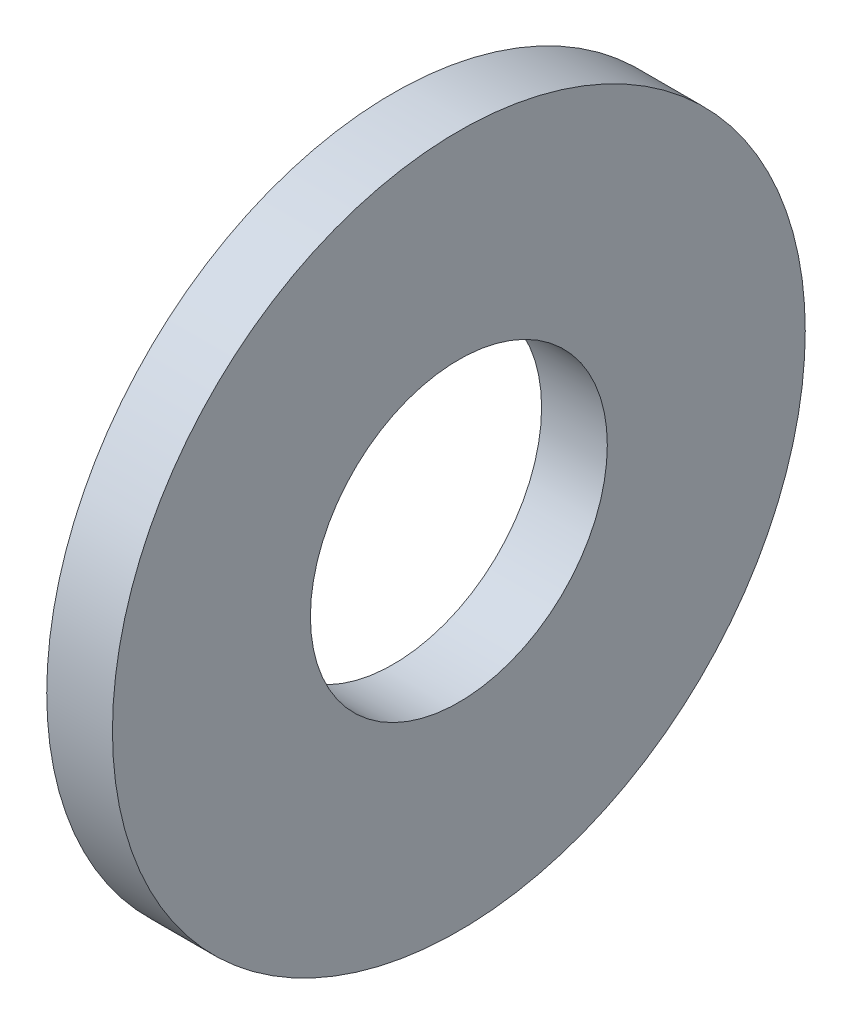
ISO-10303-21;
HEADER;
FILE_DESCRIPTION(('STEP AP214'),'2;1');
FILE_NAME('part.step','',(''),(''),'','','');
FILE_SCHEMA(('AUTOMOTIVE_DESIGN { 1 0 10303 214 1 1 1 1 }'));
ENDSEC;
DATA;
#1=APPLICATION_CONTEXT('core data for automotive mechanical design processes');
#2=APPLICATION_PROTOCOL_DEFINITION('international standard','automotive_design',2000,#1);
#3=PRODUCT_CONTEXT('',#1,'mechanical');
#4=PRODUCT('Part','Part','',(#3));
#5=PRODUCT_RELATED_PRODUCT_CATEGORY('part','',(#4));
#6=PRODUCT_DEFINITION_FORMATION('','',#4);
#7=PRODUCT_DEFINITION_CONTEXT('part definition',#1,'design');
#8=PRODUCT_DEFINITION('design','',#6,#7);
#9=PRODUCT_DEFINITION_SHAPE('','',#8);
#10=(LENGTH_UNIT() NAMED_UNIT(*) SI_UNIT(.MILLI.,.METRE.));
#11=(NAMED_UNIT(*) PLANE_ANGLE_UNIT() SI_UNIT($,.RADIAN.));
#12=(NAMED_UNIT(*) SI_UNIT($,.STERADIAN.) SOLID_ANGLE_UNIT());
#13=UNCERTAINTY_MEASURE_WITH_UNIT(LENGTH_MEASURE(1.E-05),#10,'distance_accuracy_value','');
#14=(GEOMETRIC_REPRESENTATION_CONTEXT(3) GLOBAL_UNCERTAINTY_ASSIGNED_CONTEXT((#13)) GLOBAL_UNIT_ASSIGNED_CONTEXT((#10,
#11,#12)) REPRESENTATION_CONTEXT('',''));
#15=CARTESIAN_POINT('',(0.,0.,0.));
#16=DIRECTION('',(0.,0.,1.));
#17=DIRECTION('',(1.,0.,0.));
#18=AXIS2_PLACEMENT_3D('',#15,#16,#17);
#19=CARTESIAN_POINT('',(-34.9249999999999,0.,0.));
#20=DIRECTION('',(-1.,0.,0.));
#21=DIRECTION('',(0.,0.,1.));
#22=AXIS2_PLACEMENT_3D('',#19,#20,#21);
#23=CYLINDRICAL_SURFACE('',#22,4.7625);
#24=CARTESIAN_POINT('',(0.,0.,0.));
#25=DIRECTION('',(-1.,0.,0.));
#26=DIRECTION('',(0.,0.,1.));
#27=AXIS2_PLACEMENT_3D('',#24,#25,#26);
#28=CIRCLE('',#27,4.7625);
#29=CARTESIAN_POINT('',(0.,0.,4.7625));
#30=VERTEX_POINT('',#29);
#31=EDGE_CURVE('E10',#30,#30,#28,.T.);
#32=ORIENTED_EDGE('',*,*,#31,.F.);
#33=EDGE_LOOP('',(#32));
#34=FACE_BOUND('',#33,.T.);
#35=CARTESIAN_POINT('',(-2.1082,0.,0.));
#36=DIRECTION('',(-1.,0.,0.));
#37=DIRECTION('',(0.,0.,1.));
#38=AXIS2_PLACEMENT_3D('',#35,#36,#37);
#39=CIRCLE('',#38,4.7625);
#40=CARTESIAN_POINT('',(-2.1082,0.,4.7625));
#41=VERTEX_POINT('',#40);
#42=EDGE_CURVE('E44',#41,#41,#39,.T.);
#43=ORIENTED_EDGE('',*,*,#42,.T.);
#44=EDGE_LOOP('',(#43));
#45=FACE_BOUND('',#44,.T.);
#46=ADVANCED_FACE('F30',(#34,#45),#23,.F.);
#47=CARTESIAN_POINT('',(0.,4.7625,0.));
#48=DIRECTION('',(-1.,0.,0.));
#49=DIRECTION('',(0.,0.,1.));
#50=AXIS2_PLACEMENT_3D('',#47,#48,#49);
#51=PLANE('',#50);
#52=CARTESIAN_POINT('',(0.,0.,0.));
#53=DIRECTION('',(-1.,0.,0.));
#54=DIRECTION('',(0.,0.,1.));
#55=AXIS2_PLACEMENT_3D('',#52,#53,#54);
#56=CIRCLE('',#55,11.1125);
#57=CARTESIAN_POINT('',(0.,0.,11.1125));
#58=VERTEX_POINT('',#57);
#59=EDGE_CURVE('E36',#58,#58,#56,.T.);
#60=ORIENTED_EDGE('',*,*,#59,.F.);
#61=EDGE_LOOP('',(#60));
#62=FACE_BOUND('',#61,.T.);
#63=ORIENTED_EDGE('',*,*,#31,.T.);
#64=EDGE_LOOP('',(#63));
#65=FACE_BOUND('',#64,.T.);
#66=ADVANCED_FACE('F59',(#62,#65),#51,.F.);
#67=CARTESIAN_POINT('',(-34.9249999999999,0.,0.));
#68=DIRECTION('',(-1.,0.,0.));
#69=DIRECTION('',(0.,0.,1.));
#70=AXIS2_PLACEMENT_3D('',#67,#68,#69);
#71=CYLINDRICAL_SURFACE('',#70,11.1125);
#72=CARTESIAN_POINT('',(-2.1082,0.,0.));
#73=DIRECTION('',(-1.,0.,0.));
#74=DIRECTION('',(0.,0.,1.));
#75=AXIS2_PLACEMENT_3D('',#72,#73,#74);
#76=CIRCLE('',#75,11.1125);
#77=CARTESIAN_POINT('',(-2.1082,0.,11.1125));
#78=VERTEX_POINT('',#77);
#79=EDGE_CURVE('E40',#78,#78,#76,.T.);
#80=ORIENTED_EDGE('',*,*,#79,.F.);
#81=EDGE_LOOP('',(#80));
#82=FACE_BOUND('',#81,.T.);
#83=ORIENTED_EDGE('',*,*,#59,.T.);
#84=EDGE_LOOP('',(#83));
#85=FACE_BOUND('',#84,.T.);
#86=ADVANCED_FACE('F54',(#82,#85),#71,.T.);
#87=CARTESIAN_POINT('',(-2.1082,11.1125,0.));
#88=DIRECTION('',(1.,0.,0.));
#89=DIRECTION('',(0.,0.,-1.));
#90=AXIS2_PLACEMENT_3D('',#87,#88,#89);
#91=PLANE('',#90);
#92=ORIENTED_EDGE('',*,*,#42,.F.);
#93=EDGE_LOOP('',(#92));
#94=FACE_BOUND('',#93,.T.);
#95=ORIENTED_EDGE('',*,*,#79,.T.);
#96=EDGE_LOOP('',(#95));
#97=FACE_BOUND('',#96,.T.);
#98=ADVANCED_FACE('F51',(#94,#97),#91,.F.);
#99=CLOSED_SHELL('',(#46,#66,#86,#98));
#100=MANIFOLD_SOLID_BREP('B2',#99);
#101=ADVANCED_BREP_SHAPE_REPRESENTATION('',(#18,#100),#14);
#102=SHAPE_DEFINITION_REPRESENTATION(#9,#101);
ENDSEC;
END-ISO-10303-21;
